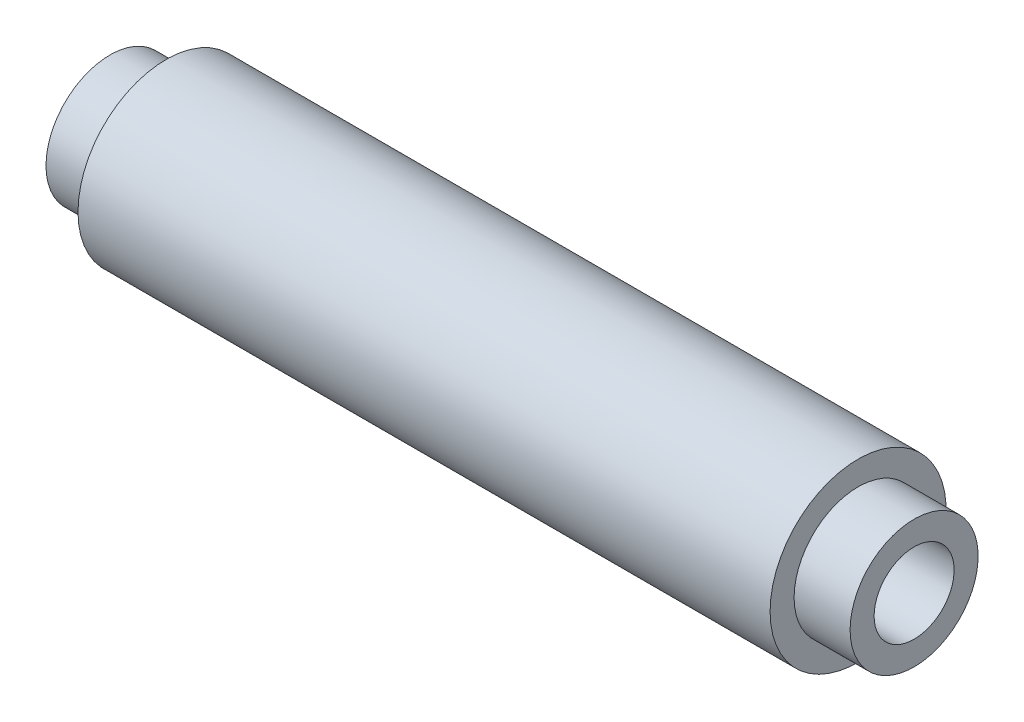
ISO-10303-21;
HEADER;
FILE_DESCRIPTION(('STEP AP214'),'2;1');
FILE_NAME('part.step','',(''),(''),'','','');
FILE_SCHEMA(('AUTOMOTIVE_DESIGN { 1 0 10303 214 1 1 1 1 }'));
ENDSEC;
DATA;
#1=APPLICATION_CONTEXT('core data for automotive mechanical design processes');
#2=APPLICATION_PROTOCOL_DEFINITION('international standard','automotive_design',2000,#1);
#3=PRODUCT_CONTEXT('',#1,'mechanical');
#4=PRODUCT('Part','Part','',(#3));
#5=PRODUCT_RELATED_PRODUCT_CATEGORY('part','',(#4));
#6=PRODUCT_DEFINITION_FORMATION('','',#4);
#7=PRODUCT_DEFINITION_CONTEXT('part definition',#1,'design');
#8=PRODUCT_DEFINITION('design','',#6,#7);
#9=PRODUCT_DEFINITION_SHAPE('','',#8);
#10=(LENGTH_UNIT() NAMED_UNIT(*) SI_UNIT(.MILLI.,.METRE.));
#11=(NAMED_UNIT(*) PLANE_ANGLE_UNIT() SI_UNIT($,.RADIAN.));
#12=(NAMED_UNIT(*) SI_UNIT($,.STERADIAN.) SOLID_ANGLE_UNIT());
#13=UNCERTAINTY_MEASURE_WITH_UNIT(LENGTH_MEASURE(1.E-05),#10,'distance_accuracy_value','');
#14=(GEOMETRIC_REPRESENTATION_CONTEXT(3) GLOBAL_UNCERTAINTY_ASSIGNED_CONTEXT((#13)) GLOBAL_UNIT_ASSIGNED_CONTEXT((#10,
#11,#12)) REPRESENTATION_CONTEXT('',''));
#15=CARTESIAN_POINT('',(0.,0.,0.));
#16=DIRECTION('',(0.,0.,1.));
#17=DIRECTION('',(1.,0.,0.));
#18=AXIS2_PLACEMENT_3D('',#15,#16,#17);
#19=CARTESIAN_POINT('',(0.,4.,0.));
#20=DIRECTION('',(1.,0.,0.));
#21=DIRECTION('',(0.,0.,-1.));
#22=AXIS2_PLACEMENT_3D('',#19,#20,#21);
#23=PLANE('',#22);
#24=CARTESIAN_POINT('',(0.,0.,0.));
#25=DIRECTION('',(-1.,0.,0.));
#26=DIRECTION('',(0.,0.,1.));
#27=AXIS2_PLACEMENT_3D('',#24,#25,#26);
#28=CIRCLE('',#27,2.5);
#29=CARTESIAN_POINT('',(0.,0.,2.5));
#30=VERTEX_POINT('',#29);
#31=EDGE_CURVE('E10',#30,#30,#28,.T.);
#32=ORIENTED_EDGE('',*,*,#31,.F.);
#33=EDGE_LOOP('',(#32));
#34=FACE_BOUND('',#33,.T.);
#35=CARTESIAN_POINT('',(0.,0.,0.));
#36=DIRECTION('',(-1.,0.,0.));
#37=DIRECTION('',(0.,0.,1.));
#38=AXIS2_PLACEMENT_3D('',#35,#36,#37);
#39=CIRCLE('',#38,4.);
#40=CARTESIAN_POINT('',(0.,0.,4.));
#41=VERTEX_POINT('',#40);
#42=EDGE_CURVE('E70',#41,#41,#39,.T.);
#43=ORIENTED_EDGE('',*,*,#42,.T.);
#44=EDGE_LOOP('',(#43));
#45=FACE_BOUND('',#44,.T.);
#46=ADVANCED_FACE('F36',(#34,#45),#23,.F.);
#47=CARTESIAN_POINT('',(0.,0.,0.));
#48=DIRECTION('',(-1.,0.,0.));
#49=DIRECTION('',(0.,0.,1.));
#50=AXIS2_PLACEMENT_3D('',#47,#48,#49);
#51=CYLINDRICAL_SURFACE('',#50,2.5);
#52=CARTESIAN_POINT('',(12.5,0.,0.));
#53=DIRECTION('',(-1.,0.,0.));
#54=DIRECTION('',(0.,0.,1.));
#55=AXIS2_PLACEMENT_3D('',#52,#53,#54);
#56=CIRCLE('',#55,2.5);
#57=CARTESIAN_POINT('',(12.5,0.,2.5));
#58=VERTEX_POINT('',#57);
#59=EDGE_CURVE('E42',#58,#58,#56,.T.);
#60=ORIENTED_EDGE('',*,*,#59,.F.);
#61=EDGE_LOOP('',(#60));
#62=FACE_BOUND('',#61,.T.);
#63=ORIENTED_EDGE('',*,*,#31,.T.);
#64=EDGE_LOOP('',(#63));
#65=FACE_BOUND('',#64,.T.);
#66=ADVANCED_FACE('F124',(#62,#65),#51,.F.);
#67=CARTESIAN_POINT('',(12.5,0.,0.));
#68=DIRECTION('',(1.,0.,0.));
#69=DIRECTION('',(0.,0.,-1.));
#70=AXIS2_PLACEMENT_3D('',#67,#68,#69);
#71=PLANE('',#70);
#72=ORIENTED_EDGE('',*,*,#59,.T.);
#73=EDGE_LOOP('',(#72));
#74=FACE_BOUND('',#73,.T.);
#75=ADVANCED_FACE('F119',(#74),#71,.F.);
#76=CARTESIAN_POINT('',(37.75,2.5,0.));
#77=DIRECTION('',(-1.,0.,0.));
#78=DIRECTION('',(0.,0.,1.));
#79=AXIS2_PLACEMENT_3D('',#76,#77,#78);
#80=PLANE('',#79);
#81=CARTESIAN_POINT('',(37.75,0.,0.));
#82=DIRECTION('',(-1.,0.,0.));
#83=DIRECTION('',(0.,0.,1.));
#84=AXIS2_PLACEMENT_3D('',#81,#82,#83);
#85=CIRCLE('',#84,2.5);
#86=CARTESIAN_POINT('',(37.75,0.,2.5));
#87=VERTEX_POINT('',#86);
#88=EDGE_CURVE('E46',#87,#87,#85,.T.);
#89=ORIENTED_EDGE('',*,*,#88,.F.);
#90=EDGE_LOOP('',(#89));
#91=FACE_BOUND('',#90,.T.);
#92=ADVANCED_FACE('F114',(#91),#80,.F.);
#93=CARTESIAN_POINT('',(0.,0.,0.));
#94=DIRECTION('',(-1.,0.,0.));
#95=DIRECTION('',(0.,0.,1.));
#96=AXIS2_PLACEMENT_3D('',#93,#94,#95);
#97=CYLINDRICAL_SURFACE('',#96,2.5);
#98=CARTESIAN_POINT('',(50.25,0.,0.));
#99=DIRECTION('',(-1.,0.,0.));
#100=DIRECTION('',(0.,0.,1.));
#101=AXIS2_PLACEMENT_3D('',#98,#99,#100);
#102=CIRCLE('',#101,2.5);
#103=CARTESIAN_POINT('',(50.25,0.,2.5));
#104=VERTEX_POINT('',#103);
#105=EDGE_CURVE('E50',#104,#104,#102,.T.);
#106=ORIENTED_EDGE('',*,*,#105,.F.);
#107=EDGE_LOOP('',(#106));
#108=FACE_BOUND('',#107,.T.);
#109=ORIENTED_EDGE('',*,*,#88,.T.);
#110=EDGE_LOOP('',(#109));
#111=FACE_BOUND('',#110,.T.);
#112=ADVANCED_FACE('F108',(#108,#111),#97,.F.);
#113=CARTESIAN_POINT('',(50.25,2.5,0.));
#114=DIRECTION('',(-1.,0.,0.));
#115=DIRECTION('',(0.,0.,1.));
#116=AXIS2_PLACEMENT_3D('',#113,#114,#115);
#117=PLANE('',#116);
#118=CARTESIAN_POINT('',(50.25,0.,0.));
#119=DIRECTION('',(-1.,0.,0.));
#120=DIRECTION('',(0.,0.,1.));
#121=AXIS2_PLACEMENT_3D('',#118,#119,#120);
#122=CIRCLE('',#121,4.00000000000001);
#123=CARTESIAN_POINT('',(50.25,0.,4.00000000000001));
#124=VERTEX_POINT('',#123);
#125=EDGE_CURVE('E55',#124,#124,#122,.T.);
#126=ORIENTED_EDGE('',*,*,#125,.F.);
#127=EDGE_LOOP('',(#126));
#128=FACE_BOUND('',#127,.T.);
#129=ORIENTED_EDGE('',*,*,#105,.T.);
#130=EDGE_LOOP('',(#129));
#131=FACE_BOUND('',#130,.T.);
#132=ADVANCED_FACE('F102',(#128,#131),#117,.F.);
#133=CARTESIAN_POINT('',(0.,0.,0.));
#134=DIRECTION('',(-1.,0.,0.));
#135=DIRECTION('',(0.,0.,1.));
#136=AXIS2_PLACEMENT_3D('',#133,#134,#135);
#137=CYLINDRICAL_SURFACE('',#136,4.00000000000001);
#138=CARTESIAN_POINT('',(46.75,0.,0.));
#139=DIRECTION('',(-1.,0.,0.));
#140=DIRECTION('',(0.,0.,1.));
#141=AXIS2_PLACEMENT_3D('',#138,#139,#140);
#142=CIRCLE('',#141,4.00000000000001);
#143=CARTESIAN_POINT('',(46.75,0.,4.00000000000001));
#144=VERTEX_POINT('',#143);
#145=EDGE_CURVE('E58',#144,#144,#142,.T.);
#146=ORIENTED_EDGE('',*,*,#145,.F.);
#147=EDGE_LOOP('',(#146));
#148=FACE_BOUND('',#147,.T.);
#149=ORIENTED_EDGE('',*,*,#125,.T.);
#150=EDGE_LOOP('',(#149));
#151=FACE_BOUND('',#150,.T.);
#152=ADVANCED_FACE('F96',(#148,#151),#137,.T.);
#153=CARTESIAN_POINT('',(46.75,4.00000000000001,0.));
#154=DIRECTION('',(-1.,0.,0.));
#155=DIRECTION('',(0.,0.,1.));
#156=AXIS2_PLACEMENT_3D('',#153,#154,#155);
#157=PLANE('',#156);
#158=CARTESIAN_POINT('',(46.75,0.,0.));
#159=DIRECTION('',(-1.,0.,0.));
#160=DIRECTION('',(0.,0.,1.));
#161=AXIS2_PLACEMENT_3D('',#158,#159,#160);
#162=CIRCLE('',#161,5.50000000000001);
#163=CARTESIAN_POINT('',(46.75,0.,5.50000000000001));
#164=VERTEX_POINT('',#163);
#165=EDGE_CURVE('E61',#164,#164,#162,.T.);
#166=ORIENTED_EDGE('',*,*,#165,.F.);
#167=EDGE_LOOP('',(#166));
#168=FACE_BOUND('',#167,.T.);
#169=ORIENTED_EDGE('',*,*,#145,.T.);
#170=EDGE_LOOP('',(#169));
#171=FACE_BOUND('',#170,.T.);
#172=ADVANCED_FACE('F90',(#168,#171),#157,.F.);
#173=CARTESIAN_POINT('',(0.,0.,0.));
#174=DIRECTION('',(-1.,0.,0.));
#175=DIRECTION('',(0.,0.,1.));
#176=AXIS2_PLACEMENT_3D('',#173,#174,#175);
#177=CYLINDRICAL_SURFACE('',#176,5.5);
#178=CARTESIAN_POINT('',(3.5,0.,0.));
#179=DIRECTION('',(-1.,0.,0.));
#180=DIRECTION('',(0.,0.,1.));
#181=AXIS2_PLACEMENT_3D('',#178,#179,#180);
#182=CIRCLE('',#181,5.49999999999999);
#183=CARTESIAN_POINT('',(3.5,0.,5.49999999999999));
#184=VERTEX_POINT('',#183);
#185=EDGE_CURVE('E64',#184,#184,#182,.T.);
#186=ORIENTED_EDGE('',*,*,#185,.F.);
#187=EDGE_LOOP('',(#186));
#188=FACE_BOUND('',#187,.T.);
#189=ORIENTED_EDGE('',*,*,#165,.T.);
#190=EDGE_LOOP('',(#189));
#191=FACE_BOUND('',#190,.T.);
#192=ADVANCED_FACE('F84',(#188,#191),#177,.T.);
#193=CARTESIAN_POINT('',(3.5,5.49999999999999,0.));
#194=DIRECTION('',(1.,0.,0.));
#195=DIRECTION('',(0.,0.,-1.));
#196=AXIS2_PLACEMENT_3D('',#193,#194,#195);
#197=PLANE('',#196);
#198=CARTESIAN_POINT('',(3.5,0.,0.));
#199=DIRECTION('',(-1.,0.,0.));
#200=DIRECTION('',(0.,0.,1.));
#201=AXIS2_PLACEMENT_3D('',#198,#199,#200);
#202=CIRCLE('',#201,4.);
#203=CARTESIAN_POINT('',(3.5,0.,4.));
#204=VERTEX_POINT('',#203);
#205=EDGE_CURVE('E67',#204,#204,#202,.T.);
#206=ORIENTED_EDGE('',*,*,#205,.F.);
#207=EDGE_LOOP('',(#206));
#208=FACE_BOUND('',#207,.T.);
#209=ORIENTED_EDGE('',*,*,#185,.T.);
#210=EDGE_LOOP('',(#209));
#211=FACE_BOUND('',#210,.T.);
#212=ADVANCED_FACE('F78',(#208,#211),#197,.F.);
#213=CARTESIAN_POINT('',(0.,0.,0.));
#214=DIRECTION('',(-1.,0.,0.));
#215=DIRECTION('',(0.,0.,1.));
#216=AXIS2_PLACEMENT_3D('',#213,#214,#215);
#217=CYLINDRICAL_SURFACE('',#216,4.);
#218=ORIENTED_EDGE('',*,*,#42,.F.);
#219=EDGE_LOOP('',(#218));
#220=FACE_BOUND('',#219,.T.);
#221=ORIENTED_EDGE('',*,*,#205,.T.);
#222=EDGE_LOOP('',(#221));
#223=FACE_BOUND('',#222,.T.);
#224=ADVANCED_FACE('F75',(#220,#223),#217,.T.);
#225=CLOSED_SHELL('',(#46,#66,#75,#92,#112,#132,#152,#172,#192,#212,#224));
#226=MANIFOLD_SOLID_BREP('B2',#225);
#227=ADVANCED_BREP_SHAPE_REPRESENTATION('',(#18,#226),#14);
#228=SHAPE_DEFINITION_REPRESENTATION(#9,#227);
ENDSEC;
END-ISO-10303-21;
